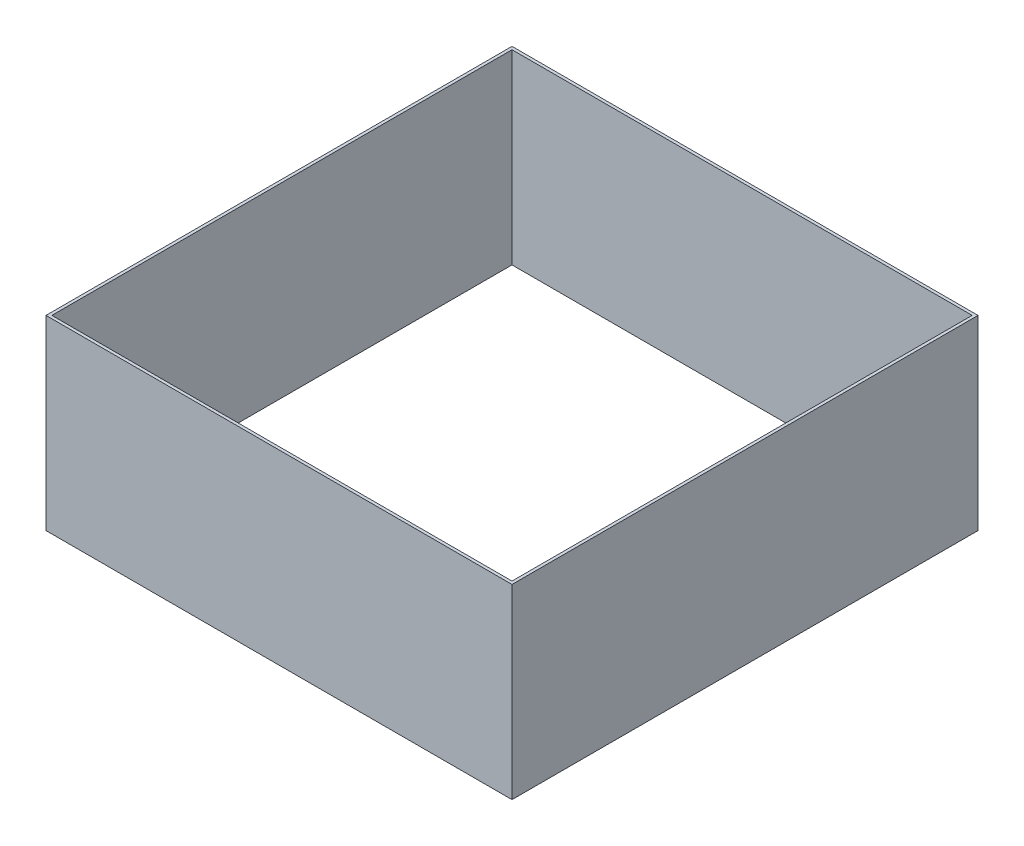
ISO-10303-21;
HEADER;
FILE_DESCRIPTION(('STEP AP214'),'2;1');
FILE_NAME('part.step','',(''),(''),'','','');
FILE_SCHEMA(('AUTOMOTIVE_DESIGN { 1 0 10303 214 1 1 1 1 }'));
ENDSEC;
DATA;
#1=APPLICATION_CONTEXT('core data for automotive mechanical design processes');
#2=APPLICATION_PROTOCOL_DEFINITION('international standard','automotive_design',2000,#1);
#3=PRODUCT_CONTEXT('',#1,'mechanical');
#4=PRODUCT('Part','Part','',(#3));
#5=PRODUCT_RELATED_PRODUCT_CATEGORY('part','',(#4));
#6=PRODUCT_DEFINITION_FORMATION('','',#4);
#7=PRODUCT_DEFINITION_CONTEXT('part definition',#1,'design');
#8=PRODUCT_DEFINITION('design','',#6,#7);
#9=PRODUCT_DEFINITION_SHAPE('','',#8);
#10=(LENGTH_UNIT() NAMED_UNIT(*) SI_UNIT(.MILLI.,.METRE.));
#11=(NAMED_UNIT(*) PLANE_ANGLE_UNIT() SI_UNIT($,.RADIAN.));
#12=(NAMED_UNIT(*) SI_UNIT($,.STERADIAN.) SOLID_ANGLE_UNIT());
#13=UNCERTAINTY_MEASURE_WITH_UNIT(LENGTH_MEASURE(1.E-05),#10,'distance_accuracy_value','');
#14=(GEOMETRIC_REPRESENTATION_CONTEXT(3) GLOBAL_UNCERTAINTY_ASSIGNED_CONTEXT((#13)) GLOBAL_UNIT_ASSIGNED_CONTEXT((#10,
#11,#12)) REPRESENTATION_CONTEXT('',''));
#15=CARTESIAN_POINT('',(0.,0.,0.));
#16=DIRECTION('',(0.,0.,1.));
#17=DIRECTION('',(1.,0.,0.));
#18=AXIS2_PLACEMENT_3D('',#15,#16,#17);
#19=CARTESIAN_POINT('',(0.,16.,0.));
#20=DIRECTION('',(0.,-1.,0.));
#21=DIRECTION('',(0.,0.,-1.));
#22=AXIS2_PLACEMENT_3D('',#19,#20,#21);
#23=PLANE('',#22);
#24=DIRECTION('',(0.,0.,1.));
#25=VECTOR('',#24,1.);
#26=CARTESIAN_POINT('',(0.,16.,0.));
#27=LINE('',#26,#25);
#28=CARTESIAN_POINT('',(0.,16.,-40.));
#29=VERTEX_POINT('',#28);
#30=CARTESIAN_POINT('',(0.,16.,0.));
#31=VERTEX_POINT('',#30);
#32=EDGE_CURVE('E156',#29,#31,#27,.T.);
#33=ORIENTED_EDGE('',*,*,#32,.T.);
#34=DIRECTION('',(1.,0.,0.));
#35=VECTOR('',#34,1.);
#36=CARTESIAN_POINT('',(0.,16.,0.));
#37=LINE('',#36,#35);
#38=CARTESIAN_POINT('',(40.,16.,0.));
#39=VERTEX_POINT('',#38);
#40=EDGE_CURVE('E160',#31,#39,#37,.T.);
#41=ORIENTED_EDGE('',*,*,#40,.T.);
#42=DIRECTION('',(0.,0.,-1.));
#43=VECTOR('',#42,1.);
#44=CARTESIAN_POINT('',(40.,16.,0.));
#45=LINE('',#44,#43);
#46=CARTESIAN_POINT('',(40.,16.,-40.));
#47=VERTEX_POINT('',#46);
#48=EDGE_CURVE('E164',#39,#47,#45,.T.);
#49=ORIENTED_EDGE('',*,*,#48,.T.);
#50=DIRECTION('',(-1.,0.,0.));
#51=VECTOR('',#50,1.);
#52=CARTESIAN_POINT('',(0.,16.,-40.));
#53=LINE('',#52,#51);
#54=EDGE_CURVE('E167',#47,#29,#53,.T.);
#55=ORIENTED_EDGE('',*,*,#54,.T.);
#56=EDGE_LOOP('',(#33,#41,#49,#55));
#57=FACE_BOUND('',#56,.T.);
#58=DIRECTION('',(0.,0.,-1.));
#59=VECTOR('',#58,1.);
#60=CARTESIAN_POINT('',(39.75,16.,-39.75));
#61=LINE('',#60,#59);
#62=CARTESIAN_POINT('',(39.75,16.,-0.25));
#63=VERTEX_POINT('',#62);
#64=CARTESIAN_POINT('',(39.75,16.,-39.75));
#65=VERTEX_POINT('',#64);
#66=EDGE_CURVE('E108',#63,#65,#61,.T.);
#67=ORIENTED_EDGE('',*,*,#66,.F.);
#68=DIRECTION('',(1.,0.,0.));
#69=VECTOR('',#68,1.);
#70=CARTESIAN_POINT('',(0.25,16.,-0.25));
#71=LINE('',#70,#69);
#72=CARTESIAN_POINT('',(0.25,16.,-0.25));
#73=VERTEX_POINT('',#72);
#74=EDGE_CURVE('E134',#73,#63,#71,.T.);
#75=ORIENTED_EDGE('',*,*,#74,.F.);
#76=DIRECTION('',(0.,0.,1.));
#77=VECTOR('',#76,1.);
#78=CARTESIAN_POINT('',(0.25,16.,-39.75));
#79=LINE('',#78,#77);
#80=CARTESIAN_POINT('',(0.25,16.,-39.75));
#81=VERTEX_POINT('',#80);
#82=EDGE_CURVE('E130',#81,#73,#79,.T.);
#83=ORIENTED_EDGE('',*,*,#82,.F.);
#84=DIRECTION('',(-1.,0.,0.));
#85=VECTOR('',#84,1.);
#86=CARTESIAN_POINT('',(0.25,16.,-39.75));
#87=LINE('',#86,#85);
#88=EDGE_CURVE('E117',#65,#81,#87,.T.);
#89=ORIENTED_EDGE('',*,*,#88,.F.);
#90=EDGE_LOOP('',(#67,#75,#83,#89));
#91=FACE_BOUND('',#90,.T.);
#92=ADVANCED_FACE('F42',(#57,#91),#23,.F.);
#93=CARTESIAN_POINT('',(0.,0.,0.));
#94=DIRECTION('',(0.,-1.,0.));
#95=DIRECTION('',(0.,0.,-1.));
#96=AXIS2_PLACEMENT_3D('',#93,#94,#95);
#97=PLANE('',#96);
#98=DIRECTION('',(0.,0.,1.));
#99=VECTOR('',#98,1.);
#100=CARTESIAN_POINT('',(0.,0.,0.));
#101=LINE('',#100,#99);
#102=CARTESIAN_POINT('',(0.,0.,-40.));
#103=VERTEX_POINT('',#102);
#104=CARTESIAN_POINT('',(0.,0.,0.));
#105=VERTEX_POINT('',#104);
#106=EDGE_CURVE('E126',#103,#105,#101,.T.);
#107=ORIENTED_EDGE('',*,*,#106,.F.);
#108=DIRECTION('',(-1.,0.,0.));
#109=VECTOR('',#108,1.);
#110=CARTESIAN_POINT('',(0.,0.,-40.));
#111=LINE('',#110,#109);
#112=CARTESIAN_POINT('',(40.,0.,-40.));
#113=VERTEX_POINT('',#112);
#114=EDGE_CURVE('E161',#113,#103,#111,.T.);
#115=ORIENTED_EDGE('',*,*,#114,.F.);
#116=DIRECTION('',(0.,0.,-1.));
#117=VECTOR('',#116,1.);
#118=CARTESIAN_POINT('',(40.,0.,0.));
#119=LINE('',#118,#117);
#120=CARTESIAN_POINT('',(40.,0.,0.));
#121=VERTEX_POINT('',#120);
#122=EDGE_CURVE('E177',#121,#113,#119,.T.);
#123=ORIENTED_EDGE('',*,*,#122,.F.);
#124=DIRECTION('',(1.,0.,0.));
#125=VECTOR('',#124,1.);
#126=CARTESIAN_POINT('',(0.,0.,0.));
#127=LINE('',#126,#125);
#128=EDGE_CURVE('E174',#105,#121,#127,.T.);
#129=ORIENTED_EDGE('',*,*,#128,.F.);
#130=EDGE_LOOP('',(#107,#115,#123,#129));
#131=FACE_BOUND('',#130,.T.);
#132=DIRECTION('',(1.,0.,0.));
#133=VECTOR('',#132,1.);
#134=CARTESIAN_POINT('',(0.25,0.,-0.25));
#135=LINE('',#134,#133);
#136=CARTESIAN_POINT('',(0.25,0.,-0.25));
#137=VERTEX_POINT('',#136);
#138=CARTESIAN_POINT('',(39.75,0.,-0.25));
#139=VERTEX_POINT('',#138);
#140=EDGE_CURVE('E118',#137,#139,#135,.T.);
#141=ORIENTED_EDGE('',*,*,#140,.T.);
#142=DIRECTION('',(0.,0.,-1.));
#143=VECTOR('',#142,1.);
#144=CARTESIAN_POINT('',(39.75,0.,-39.75));
#145=LINE('',#144,#143);
#146=CARTESIAN_POINT('',(39.75,0.,-39.75));
#147=VERTEX_POINT('',#146);
#148=EDGE_CURVE('E66',#139,#147,#145,.T.);
#149=ORIENTED_EDGE('',*,*,#148,.T.);
#150=DIRECTION('',(-1.,0.,0.));
#151=VECTOR('',#150,1.);
#152=CARTESIAN_POINT('',(0.25,0.,-39.75));
#153=LINE('',#152,#151);
#154=CARTESIAN_POINT('',(0.25,0.,-39.75));
#155=VERTEX_POINT('',#154);
#156=EDGE_CURVE('E124',#147,#155,#153,.T.);
#157=ORIENTED_EDGE('',*,*,#156,.T.);
#158=DIRECTION('',(0.,0.,1.));
#159=VECTOR('',#158,1.);
#160=CARTESIAN_POINT('',(0.25,0.,-39.75));
#161=LINE('',#160,#159);
#162=EDGE_CURVE('E143',#155,#137,#161,.T.);
#163=ORIENTED_EDGE('',*,*,#162,.T.);
#164=EDGE_LOOP('',(#141,#149,#157,#163));
#165=FACE_BOUND('',#164,.T.);
#166=ADVANCED_FACE('F200',(#131,#165),#97,.T.);
#167=CARTESIAN_POINT('',(0.,16.,0.));
#168=DIRECTION('',(1.,0.,0.));
#169=DIRECTION('',(0.,0.,-1.));
#170=AXIS2_PLACEMENT_3D('',#167,#168,#169);
#171=PLANE('',#170);
#172=ORIENTED_EDGE('',*,*,#106,.T.);
#173=DIRECTION('',(0.,-1.,0.));
#174=VECTOR('',#173,1.);
#175=CARTESIAN_POINT('',(0.,16.,0.));
#176=LINE('',#175,#174);
#177=EDGE_CURVE('E11',#31,#105,#176,.T.);
#178=ORIENTED_EDGE('',*,*,#177,.F.);
#179=ORIENTED_EDGE('',*,*,#32,.F.);
#180=DIRECTION('',(0.,-1.,0.));
#181=VECTOR('',#180,1.);
#182=CARTESIAN_POINT('',(0.,16.,-40.));
#183=LINE('',#182,#181);
#184=EDGE_CURVE('E170',#29,#103,#183,.T.);
#185=ORIENTED_EDGE('',*,*,#184,.T.);
#186=EDGE_LOOP('',(#172,#178,#179,#185));
#187=FACE_BOUND('',#186,.T.);
#188=ADVANCED_FACE('F44',(#187),#171,.F.);
#189=CARTESIAN_POINT('',(0.,16.,0.));
#190=DIRECTION('',(0.,0.,-1.));
#191=DIRECTION('',(-1.,0.,0.));
#192=AXIS2_PLACEMENT_3D('',#189,#190,#191);
#193=PLANE('',#192);
#194=ORIENTED_EDGE('',*,*,#128,.T.);
#195=DIRECTION('',(0.,-1.,0.));
#196=VECTOR('',#195,1.);
#197=CARTESIAN_POINT('',(40.,16.,0.));
#198=LINE('',#197,#196);
#199=EDGE_CURVE('E51',#39,#121,#198,.T.);
#200=ORIENTED_EDGE('',*,*,#199,.F.);
#201=ORIENTED_EDGE('',*,*,#40,.F.);
#202=ORIENTED_EDGE('',*,*,#177,.T.);
#203=EDGE_LOOP('',(#194,#200,#201,#202));
#204=FACE_BOUND('',#203,.T.);
#205=ADVANCED_FACE('F210',(#204),#193,.F.);
#206=CARTESIAN_POINT('',(40.,16.,0.));
#207=DIRECTION('',(-1.,0.,0.));
#208=DIRECTION('',(0.,0.,1.));
#209=AXIS2_PLACEMENT_3D('',#206,#207,#208);
#210=PLANE('',#209);
#211=ORIENTED_EDGE('',*,*,#122,.T.);
#212=DIRECTION('',(0.,-1.,0.));
#213=VECTOR('',#212,1.);
#214=CARTESIAN_POINT('',(40.,16.,-40.));
#215=LINE('',#214,#213);
#216=EDGE_CURVE('E185',#47,#113,#215,.T.);
#217=ORIENTED_EDGE('',*,*,#216,.F.);
#218=ORIENTED_EDGE('',*,*,#48,.F.);
#219=ORIENTED_EDGE('',*,*,#199,.T.);
#220=EDGE_LOOP('',(#211,#217,#218,#219));
#221=FACE_BOUND('',#220,.T.);
#222=ADVANCED_FACE('F194',(#221),#210,.F.);
#223=CARTESIAN_POINT('',(0.,16.,-40.));
#224=DIRECTION('',(0.,0.,1.));
#225=DIRECTION('',(1.,0.,0.));
#226=AXIS2_PLACEMENT_3D('',#223,#224,#225);
#227=PLANE('',#226);
#228=ORIENTED_EDGE('',*,*,#114,.T.);
#229=ORIENTED_EDGE('',*,*,#184,.F.);
#230=ORIENTED_EDGE('',*,*,#54,.F.);
#231=ORIENTED_EDGE('',*,*,#216,.T.);
#232=EDGE_LOOP('',(#228,#229,#230,#231));
#233=FACE_BOUND('',#232,.T.);
#234=ADVANCED_FACE('F204',(#233),#227,.F.);
#235=CARTESIAN_POINT('',(39.75,16.,-39.75));
#236=DIRECTION('',(-1.,0.,0.));
#237=DIRECTION('',(0.,0.,1.));
#238=AXIS2_PLACEMENT_3D('',#235,#236,#237);
#239=PLANE('',#238);
#240=ORIENTED_EDGE('',*,*,#148,.F.);
#241=DIRECTION('',(0.,-1.,0.));
#242=VECTOR('',#241,1.);
#243=CARTESIAN_POINT('',(39.75,16.,-0.25));
#244=LINE('',#243,#242);
#245=EDGE_CURVE('E112',#63,#139,#244,.T.);
#246=ORIENTED_EDGE('',*,*,#245,.F.);
#247=ORIENTED_EDGE('',*,*,#66,.T.);
#248=DIRECTION('',(0.,-1.,0.));
#249=VECTOR('',#248,1.);
#250=CARTESIAN_POINT('',(39.75,16.,-39.75));
#251=LINE('',#250,#249);
#252=EDGE_CURVE('E111',#65,#147,#251,.T.);
#253=ORIENTED_EDGE('',*,*,#252,.T.);
#254=EDGE_LOOP('',(#240,#246,#247,#253));
#255=FACE_BOUND('',#254,.T.);
#256=ADVANCED_FACE('F110',(#255),#239,.T.);
#257=CARTESIAN_POINT('',(0.25,16.,-39.75));
#258=DIRECTION('',(0.,0.,1.));
#259=DIRECTION('',(1.,0.,0.));
#260=AXIS2_PLACEMENT_3D('',#257,#258,#259);
#261=PLANE('',#260);
#262=ORIENTED_EDGE('',*,*,#156,.F.);
#263=ORIENTED_EDGE('',*,*,#252,.F.);
#264=ORIENTED_EDGE('',*,*,#88,.T.);
#265=DIRECTION('',(0.,-1.,0.));
#266=VECTOR('',#265,1.);
#267=CARTESIAN_POINT('',(0.25,16.,-39.75));
#268=LINE('',#267,#266);
#269=EDGE_CURVE('E127',#81,#155,#268,.T.);
#270=ORIENTED_EDGE('',*,*,#269,.T.);
#271=EDGE_LOOP('',(#262,#263,#264,#270));
#272=FACE_BOUND('',#271,.T.);
#273=ADVANCED_FACE('F121',(#272),#261,.T.);
#274=CARTESIAN_POINT('',(0.25,16.,-39.75));
#275=DIRECTION('',(1.,0.,0.));
#276=DIRECTION('',(0.,0.,-1.));
#277=AXIS2_PLACEMENT_3D('',#274,#275,#276);
#278=PLANE('',#277);
#279=ORIENTED_EDGE('',*,*,#162,.F.);
#280=ORIENTED_EDGE('',*,*,#269,.F.);
#281=ORIENTED_EDGE('',*,*,#82,.T.);
#282=DIRECTION('',(0.,-1.,0.));
#283=VECTOR('',#282,1.);
#284=CARTESIAN_POINT('',(0.25,16.,-0.25));
#285=LINE('',#284,#283);
#286=EDGE_CURVE('E58',#73,#137,#285,.T.);
#287=ORIENTED_EDGE('',*,*,#286,.T.);
#288=EDGE_LOOP('',(#279,#280,#281,#287));
#289=FACE_BOUND('',#288,.T.);
#290=ADVANCED_FACE('F233',(#289),#278,.T.);
#291=CARTESIAN_POINT('',(0.25,16.,-0.25));
#292=DIRECTION('',(0.,0.,-1.));
#293=DIRECTION('',(-1.,0.,0.));
#294=AXIS2_PLACEMENT_3D('',#291,#292,#293);
#295=PLANE('',#294);
#296=ORIENTED_EDGE('',*,*,#140,.F.);
#297=ORIENTED_EDGE('',*,*,#286,.F.);
#298=ORIENTED_EDGE('',*,*,#74,.T.);
#299=ORIENTED_EDGE('',*,*,#245,.T.);
#300=EDGE_LOOP('',(#296,#297,#298,#299));
#301=FACE_BOUND('',#300,.T.);
#302=ADVANCED_FACE('F237',(#301),#295,.T.);
#303=CLOSED_SHELL('',(#92,#166,#188,#205,#222,#234,#256,#273,#290,#302));
#304=MANIFOLD_SOLID_BREP('B2',#303);
#305=ADVANCED_BREP_SHAPE_REPRESENTATION('',(#18,#304),#14);
#306=SHAPE_DEFINITION_REPRESENTATION(#9,#305);
ENDSEC;
END-ISO-10303-21;
